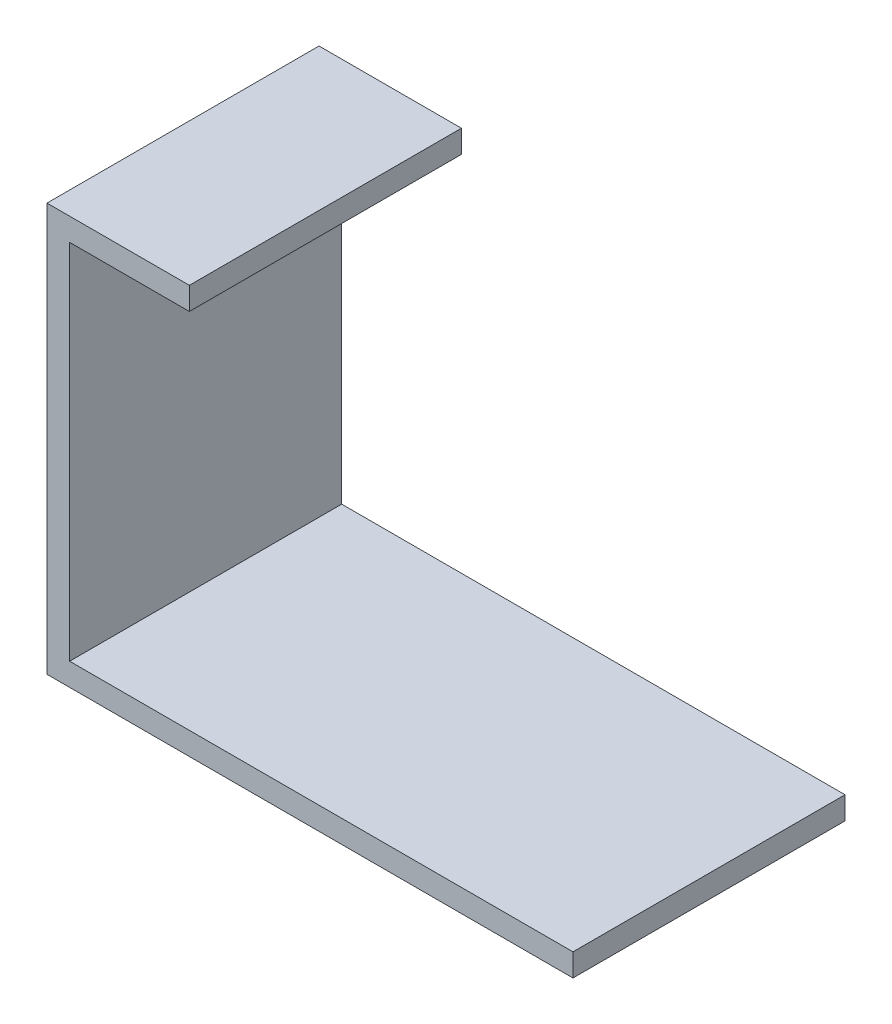
ISO-10303-21;
HEADER;
FILE_DESCRIPTION(('STEP AP214'),'2;1');
FILE_NAME('part.step','',(''),(''),'','','');
FILE_SCHEMA(('AUTOMOTIVE_DESIGN { 1 0 10303 214 1 1 1 1 }'));
ENDSEC;
DATA;
#1=APPLICATION_CONTEXT('core data for automotive mechanical design processes');
#2=APPLICATION_PROTOCOL_DEFINITION('international standard','automotive_design',2000,#1);
#3=PRODUCT_CONTEXT('',#1,'mechanical');
#4=PRODUCT('Part','Part','',(#3));
#5=PRODUCT_RELATED_PRODUCT_CATEGORY('part','',(#4));
#6=PRODUCT_DEFINITION_FORMATION('','',#4);
#7=PRODUCT_DEFINITION_CONTEXT('part definition',#1,'design');
#8=PRODUCT_DEFINITION('design','',#6,#7);
#9=PRODUCT_DEFINITION_SHAPE('','',#8);
#10=(LENGTH_UNIT() NAMED_UNIT(*) SI_UNIT(.MILLI.,.METRE.));
#11=(NAMED_UNIT(*) PLANE_ANGLE_UNIT() SI_UNIT($,.RADIAN.));
#12=(NAMED_UNIT(*) SI_UNIT($,.STERADIAN.) SOLID_ANGLE_UNIT());
#13=UNCERTAINTY_MEASURE_WITH_UNIT(LENGTH_MEASURE(1.E-05),#10,'distance_accuracy_value','');
#14=(GEOMETRIC_REPRESENTATION_CONTEXT(3) GLOBAL_UNCERTAINTY_ASSIGNED_CONTEXT((#13)) GLOBAL_UNIT_ASSIGNED_CONTEXT((#10,
#11,#12)) REPRESENTATION_CONTEXT('',''));
#15=CARTESIAN_POINT('',(0.,0.,0.));
#16=DIRECTION('',(0.,0.,1.));
#17=DIRECTION('',(1.,0.,0.));
#18=AXIS2_PLACEMENT_3D('',#15,#16,#17);
#19=CARTESIAN_POINT('',(-1.26719739563769,-1.98186928584775,0.));
#20=DIRECTION('',(0.,0.,1.));
#21=DIRECTION('',(1.,0.,0.));
#22=AXIS2_PLACEMENT_3D('',#19,#20,#21);
#23=PLANE('',#22);
#24=DIRECTION('',(1.,0.,0.));
#25=VECTOR('',#24,1.);
#26=CARTESIAN_POINT('',(-1.34129433347151,-0.419419514745978,0.));
#27=LINE('',#26,#25);
#28=CARTESIAN_POINT('',(-1.34129433347151,-0.419419514745978,0.));
#29=VERTEX_POINT('',#28);
#30=CARTESIAN_POINT('',(-8.4937254388325E-12,-0.419419514745978,0.));
#31=VERTEX_POINT('',#30);
#32=EDGE_CURVE('E28',#29,#31,#27,.T.);
#33=ORIENTED_EDGE('',*,*,#32,.F.);
#34=DIRECTION('',(2.29346673915155E-12,1.,0.));
#35=VECTOR('',#34,1.);
#36=CARTESIAN_POINT('',(-1.34129433348141,-4.73741951474598,0.));
#37=LINE('',#36,#35);
#38=CARTESIAN_POINT('',(-1.34129433348141,-4.48341951474598,0.));
#39=VERTEX_POINT('',#38);
#40=EDGE_CURVE('E80',#39,#29,#37,.T.);
#41=ORIENTED_EDGE('',*,*,#40,.F.);
#42=DIRECTION('',(1.,0.,0.));
#43=VECTOR('',#42,1.);
#44=CARTESIAN_POINT('',(0.0684056665185892,-4.48341951474598,0.));
#45=LINE('',#44,#43);
#46=CARTESIAN_POINT('',(4.2975056665186,-4.48341951474598,0.));
#47=VERTEX_POINT('',#46);
#48=EDGE_CURVE('E72',#39,#47,#45,.T.);
#49=ORIENTED_EDGE('',*,*,#48,.T.);
#50=DIRECTION('',(0.,-1.,0.));
#51=VECTOR('',#50,1.);
#52=CARTESIAN_POINT('',(4.2975056665186,-4.54691951474598,0.));
#53=LINE('',#52,#51);
#54=CARTESIAN_POINT('',(4.2975056665186,-4.73741951474598,0.));
#55=VERTEX_POINT('',#54);
#56=EDGE_CURVE('E77',#47,#55,#53,.T.);
#57=ORIENTED_EDGE('',*,*,#56,.T.);
#58=DIRECTION('',(1.,0.,0.));
#59=VECTOR('',#58,1.);
#60=CARTESIAN_POINT('',(-1.59529433347151,-4.73741951474598,0.));
#61=LINE('',#60,#59);
#62=CARTESIAN_POINT('',(-1.59529433347151,-4.73741951474598,0.));
#63=VERTEX_POINT('',#62);
#64=EDGE_CURVE('E109',#63,#55,#61,.T.);
#65=ORIENTED_EDGE('',*,*,#64,.F.);
#66=DIRECTION('',(0.,-1.,0.));
#67=VECTOR('',#66,1.);
#68=CARTESIAN_POINT('',(-1.59529433347151,-0.165419514745979,0.));
#69=LINE('',#68,#67);
#70=CARTESIAN_POINT('',(-1.59529433347151,-0.165419514745979,0.));
#71=VERTEX_POINT('',#70);
#72=EDGE_CURVE('E130',#71,#63,#69,.T.);
#73=ORIENTED_EDGE('',*,*,#72,.F.);
#74=DIRECTION('',(-1.,0.,0.));
#75=VECTOR('',#74,1.);
#76=CARTESIAN_POINT('',(-8.49376124989476E-12,-0.165419514745979,0.));
#77=LINE('',#76,#75);
#78=CARTESIAN_POINT('',(-8.49376124989476E-12,-0.165419514745979,0.));
#79=VERTEX_POINT('',#78);
#80=EDGE_CURVE('E113',#79,#71,#77,.T.);
#81=ORIENTED_EDGE('',*,*,#80,.F.);
#82=DIRECTION('',(0.,1.,0.));
#83=VECTOR('',#82,1.);
#84=CARTESIAN_POINT('',(-8.4937254388325E-12,-0.419419514745978,0.));
#85=LINE('',#84,#83);
#86=EDGE_CURVE('E120',#31,#79,#85,.T.);
#87=ORIENTED_EDGE('',*,*,#86,.F.);
#88=EDGE_LOOP('',(#33,#41,#49,#57,#65,#73,#81,#87));
#89=FACE_BOUND('',#88,.T.);
#90=ADVANCED_FACE('F17',(#89),#23,.F.);
#91=CARTESIAN_POINT('',(-1.26719739563769,-1.98186928584775,3.048));
#92=DIRECTION('',(0.,0.,1.));
#93=DIRECTION('',(1.,0.,0.));
#94=AXIS2_PLACEMENT_3D('',#91,#92,#93);
#95=PLANE('',#94);
#96=DIRECTION('',(1.,0.,0.));
#97=VECTOR('',#96,1.);
#98=CARTESIAN_POINT('',(-1.34129433347151,-0.419419514745978,3.048));
#99=LINE('',#98,#97);
#100=CARTESIAN_POINT('',(-1.34129433347151,-0.419419514745978,3.048));
#101=VERTEX_POINT('',#100);
#102=CARTESIAN_POINT('',(-8.49376124989476E-12,-0.419419514745978,3.048));
#103=VERTEX_POINT('',#102);
#104=EDGE_CURVE('E11',#101,#103,#99,.T.);
#105=ORIENTED_EDGE('',*,*,#104,.T.);
#106=DIRECTION('',(0.,1.,0.));
#107=VECTOR('',#106,1.);
#108=CARTESIAN_POINT('',(-8.4937254388325E-12,-0.419419514745978,3.048));
#109=LINE('',#108,#107);
#110=CARTESIAN_POINT('',(-8.49376124989476E-12,-0.165419514745979,3.048));
#111=VERTEX_POINT('',#110);
#112=EDGE_CURVE('E21',#103,#111,#109,.T.);
#113=ORIENTED_EDGE('',*,*,#112,.T.);
#114=DIRECTION('',(-1.,0.,0.));
#115=VECTOR('',#114,1.);
#116=CARTESIAN_POINT('',(-8.49376124989476E-12,-0.165419514745979,3.048));
#117=LINE('',#116,#115);
#118=CARTESIAN_POINT('',(-1.59529433347151,-0.165419514745979,3.048));
#119=VERTEX_POINT('',#118);
#120=EDGE_CURVE('E137',#111,#119,#117,.T.);
#121=ORIENTED_EDGE('',*,*,#120,.T.);
#122=DIRECTION('',(0.,-1.,0.));
#123=VECTOR('',#122,1.);
#124=CARTESIAN_POINT('',(-1.59529433347151,-0.165419514745979,3.048));
#125=LINE('',#124,#123);
#126=CARTESIAN_POINT('',(-1.59529433347151,-4.73741951474598,3.048));
#127=VERTEX_POINT('',#126);
#128=EDGE_CURVE('E114',#119,#127,#125,.T.);
#129=ORIENTED_EDGE('',*,*,#128,.T.);
#130=DIRECTION('',(1.,0.,0.));
#131=VECTOR('',#130,1.);
#132=CARTESIAN_POINT('',(-1.59529433347151,-4.73741951474598,3.048));
#133=LINE('',#132,#131);
#134=CARTESIAN_POINT('',(4.2975056665186,-4.73741951474598,3.048));
#135=VERTEX_POINT('',#134);
#136=EDGE_CURVE('E148',#127,#135,#133,.T.);
#137=ORIENTED_EDGE('',*,*,#136,.T.);
#138=DIRECTION('',(0.,1.,0.));
#139=VECTOR('',#138,1.);
#140=CARTESIAN_POINT('',(4.2975056665186,-4.73741951474598,3.048));
#141=LINE('',#140,#139);
#142=CARTESIAN_POINT('',(4.2975056665186,-4.48341951474598,3.048));
#143=VERTEX_POINT('',#142);
#144=EDGE_CURVE('E97',#135,#143,#141,.T.);
#145=ORIENTED_EDGE('',*,*,#144,.T.);
#146=DIRECTION('',(-1.,0.,0.));
#147=VECTOR('',#146,1.);
#148=CARTESIAN_POINT('',(4.2975056665186,-4.48341951474598,3.048));
#149=LINE('',#148,#147);
#150=CARTESIAN_POINT('',(-1.34129433348141,-4.48341951474598,3.048));
#151=VERTEX_POINT('',#150);
#152=EDGE_CURVE('E92',#143,#151,#149,.T.);
#153=ORIENTED_EDGE('',*,*,#152,.T.);
#154=DIRECTION('',(2.29346673915155E-12,1.,0.));
#155=VECTOR('',#154,1.);
#156=CARTESIAN_POINT('',(-1.34129433348141,-4.73741951474598,3.048));
#157=LINE('',#156,#155);
#158=EDGE_CURVE('E116',#151,#101,#157,.T.);
#159=ORIENTED_EDGE('',*,*,#158,.T.);
#160=EDGE_LOOP('',(#105,#113,#121,#129,#137,#145,#153,#159));
#161=FACE_BOUND('',#160,.T.);
#162=ADVANCED_FACE('F166',(#161),#95,.T.);
#163=CARTESIAN_POINT('',(-1.34129433347151,-0.419419514745978,0.));
#164=DIRECTION('',(0.,-1.,0.));
#165=DIRECTION('',(0.,0.,-1.));
#166=AXIS2_PLACEMENT_3D('',#163,#164,#165);
#167=PLANE('',#166);
#168=ORIENTED_EDGE('',*,*,#32,.T.);
#169=DIRECTION('',(0.,0.,1.));
#170=VECTOR('',#169,1.);
#171=CARTESIAN_POINT('',(-8.4937254388325E-12,-0.419419514745978,0.));
#172=LINE('',#171,#170);
#173=EDGE_CURVE('E127',#31,#103,#172,.T.);
#174=ORIENTED_EDGE('',*,*,#173,.T.);
#175=ORIENTED_EDGE('',*,*,#104,.F.);
#176=DIRECTION('',(0.,0.,1.));
#177=VECTOR('',#176,1.);
#178=CARTESIAN_POINT('',(-1.34129433347151,-0.419419514745978,0.));
#179=LINE('',#178,#177);
#180=EDGE_CURVE('E119',#29,#101,#179,.T.);
#181=ORIENTED_EDGE('',*,*,#180,.F.);
#182=EDGE_LOOP('',(#168,#174,#175,#181));
#183=FACE_BOUND('',#182,.T.);
#184=ADVANCED_FACE('F209',(#183),#167,.T.);
#185=CARTESIAN_POINT('',(-8.4937254388325E-12,-0.419419514745978,0.));
#186=DIRECTION('',(1.,0.,0.));
#187=DIRECTION('',(0.,1.,0.));
#188=AXIS2_PLACEMENT_3D('',#185,#186,#187);
#189=PLANE('',#188);
#190=ORIENTED_EDGE('',*,*,#86,.T.);
#191=DIRECTION('',(0.,0.,1.));
#192=VECTOR('',#191,1.);
#193=CARTESIAN_POINT('',(-8.49376124989476E-12,-0.165419514745979,0.));
#194=LINE('',#193,#192);
#195=EDGE_CURVE('E124',#79,#111,#194,.T.);
#196=ORIENTED_EDGE('',*,*,#195,.T.);
#197=ORIENTED_EDGE('',*,*,#112,.F.);
#198=ORIENTED_EDGE('',*,*,#173,.F.);
#199=EDGE_LOOP('',(#190,#196,#197,#198));
#200=FACE_BOUND('',#199,.T.);
#201=ADVANCED_FACE('F226',(#200),#189,.T.);
#202=CARTESIAN_POINT('',(-8.49376124989476E-12,-0.165419514745979,0.));
#203=DIRECTION('',(0.,1.,0.));
#204=DIRECTION('',(1.,0.,0.));
#205=AXIS2_PLACEMENT_3D('',#202,#203,#204);
#206=PLANE('',#205);
#207=ORIENTED_EDGE('',*,*,#80,.T.);
#208=DIRECTION('',(0.,0.,1.));
#209=VECTOR('',#208,1.);
#210=CARTESIAN_POINT('',(-1.59529433347151,-0.165419514745979,0.));
#211=LINE('',#210,#209);
#212=EDGE_CURVE('E111',#71,#119,#211,.T.);
#213=ORIENTED_EDGE('',*,*,#212,.T.);
#214=ORIENTED_EDGE('',*,*,#120,.F.);
#215=ORIENTED_EDGE('',*,*,#195,.F.);
#216=EDGE_LOOP('',(#207,#213,#214,#215));
#217=FACE_BOUND('',#216,.T.);
#218=ADVANCED_FACE('F175',(#217),#206,.T.);
#219=CARTESIAN_POINT('',(-1.59529433347151,-0.165419514745979,0.));
#220=DIRECTION('',(-1.,0.,0.));
#221=DIRECTION('',(0.,0.,1.));
#222=AXIS2_PLACEMENT_3D('',#219,#220,#221);
#223=PLANE('',#222);
#224=ORIENTED_EDGE('',*,*,#72,.T.);
#225=DIRECTION('',(0.,0.,1.));
#226=VECTOR('',#225,1.);
#227=CARTESIAN_POINT('',(-1.59529433347151,-4.73741951474598,0.));
#228=LINE('',#227,#226);
#229=EDGE_CURVE('E134',#63,#127,#228,.T.);
#230=ORIENTED_EDGE('',*,*,#229,.T.);
#231=ORIENTED_EDGE('',*,*,#128,.F.);
#232=ORIENTED_EDGE('',*,*,#212,.F.);
#233=EDGE_LOOP('',(#224,#230,#231,#232));
#234=FACE_BOUND('',#233,.T.);
#235=ADVANCED_FACE('F179',(#234),#223,.T.);
#236=CARTESIAN_POINT('',(-1.59529433347151,-4.73741951474598,0.));
#237=DIRECTION('',(0.,-1.,0.));
#238=DIRECTION('',(0.,0.,-1.));
#239=AXIS2_PLACEMENT_3D('',#236,#237,#238);
#240=PLANE('',#239);
#241=ORIENTED_EDGE('',*,*,#64,.T.);
#242=DIRECTION('',(0.,0.,-1.));
#243=VECTOR('',#242,1.);
#244=CARTESIAN_POINT('',(4.2975056665186,-4.73741951474598,3.048));
#245=LINE('',#244,#243);
#246=EDGE_CURVE('E86',#135,#55,#245,.T.);
#247=ORIENTED_EDGE('',*,*,#246,.F.);
#248=ORIENTED_EDGE('',*,*,#136,.F.);
#249=ORIENTED_EDGE('',*,*,#229,.F.);
#250=EDGE_LOOP('',(#241,#247,#248,#249));
#251=FACE_BOUND('',#250,.T.);
#252=ADVANCED_FACE('F185',(#251),#240,.T.);
#253=CARTESIAN_POINT('',(-1.34129433348141,-4.73741951474598,0.));
#254=DIRECTION('',(1.,-2.29346673915155E-12,0.));
#255=DIRECTION('',(-2.29346673915155E-12,-1.,0.));
#256=AXIS2_PLACEMENT_3D('',#253,#254,#255);
#257=PLANE('',#256);
#258=DIRECTION('',(0.,0.,-1.));
#259=VECTOR('',#258,1.);
#260=CARTESIAN_POINT('',(-1.34129433348083,-4.48341951474598,1.524));
#261=LINE('',#260,#259);
#262=EDGE_CURVE('E85',#151,#39,#261,.T.);
#263=ORIENTED_EDGE('',*,*,#262,.T.);
#264=ORIENTED_EDGE('',*,*,#40,.T.);
#265=ORIENTED_EDGE('',*,*,#180,.T.);
#266=ORIENTED_EDGE('',*,*,#158,.F.);
#267=EDGE_LOOP('',(#263,#264,#265,#266));
#268=FACE_BOUND('',#267,.T.);
#269=ADVANCED_FACE('F19',(#268),#257,.T.);
#270=CARTESIAN_POINT('',(-1.34129433348141,-4.48341951474598,3.048));
#271=DIRECTION('',(0.,1.,0.));
#272=DIRECTION('',(1.,0.,0.));
#273=AXIS2_PLACEMENT_3D('',#270,#271,#272);
#274=PLANE('',#273);
#275=ORIENTED_EDGE('',*,*,#48,.F.);
#276=ORIENTED_EDGE('',*,*,#262,.F.);
#277=ORIENTED_EDGE('',*,*,#152,.F.);
#278=DIRECTION('',(0.,0.,-1.));
#279=VECTOR('',#278,1.);
#280=CARTESIAN_POINT('',(4.2975056665186,-4.48341951474598,3.048));
#281=LINE('',#280,#279);
#282=EDGE_CURVE('E89',#143,#47,#281,.T.);
#283=ORIENTED_EDGE('',*,*,#282,.T.);
#284=EDGE_LOOP('',(#275,#276,#277,#283));
#285=FACE_BOUND('',#284,.T.);
#286=ADVANCED_FACE('F90',(#285),#274,.T.);
#287=CARTESIAN_POINT('',(4.2975056665186,-4.48341951474598,3.048));
#288=DIRECTION('',(1.,0.,0.));
#289=DIRECTION('',(0.,1.,0.));
#290=AXIS2_PLACEMENT_3D('',#287,#288,#289);
#291=PLANE('',#290);
#292=ORIENTED_EDGE('',*,*,#56,.F.);
#293=ORIENTED_EDGE('',*,*,#282,.F.);
#294=ORIENTED_EDGE('',*,*,#144,.F.);
#295=ORIENTED_EDGE('',*,*,#246,.T.);
#296=EDGE_LOOP('',(#292,#293,#294,#295));
#297=FACE_BOUND('',#296,.T.);
#298=ADVANCED_FACE('F100',(#297),#291,.T.);
#299=CLOSED_SHELL('',(#90,#162,#184,#201,#218,#235,#252,#269,#286,#298));
#300=MANIFOLD_SOLID_BREP('B1',#299);
#301=ADVANCED_BREP_SHAPE_REPRESENTATION('',(#18,#300),#14);
#302=SHAPE_DEFINITION_REPRESENTATION(#9,#301);
ENDSEC;
END-ISO-10303-21;
